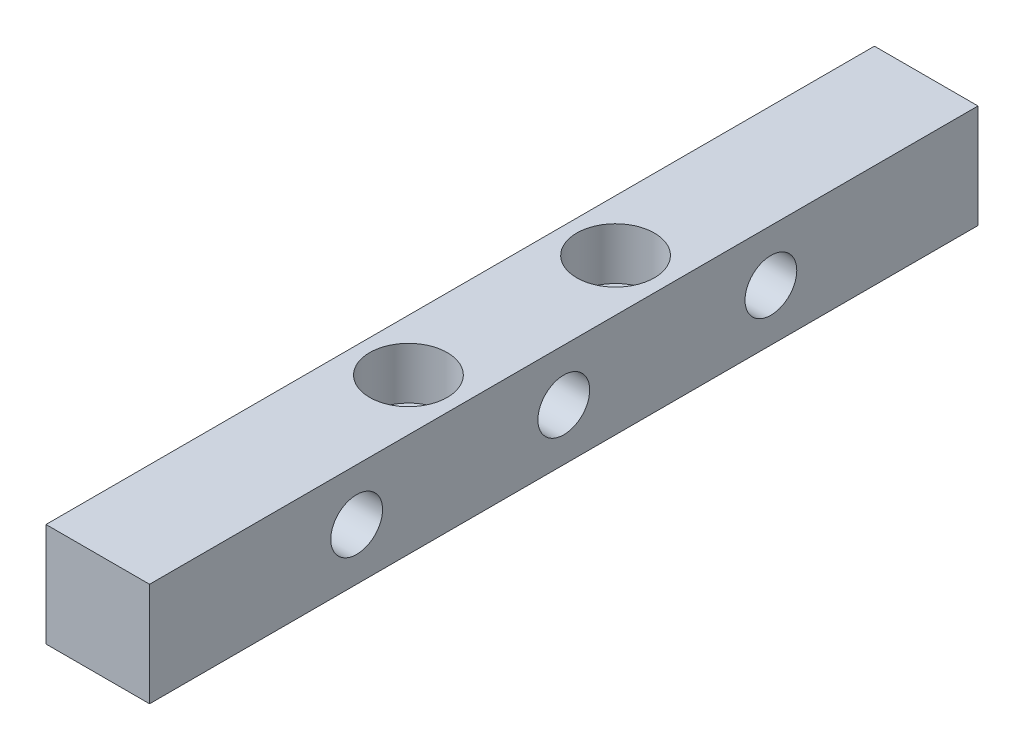
ISO-10303-21;
HEADER;
FILE_DESCRIPTION(('STEP AP214'),'2;1');
FILE_NAME('part.step','',(''),(''),'','','');
FILE_SCHEMA(('AUTOMOTIVE_DESIGN { 1 0 10303 214 1 1 1 1 }'));
ENDSEC;
DATA;
#1=APPLICATION_CONTEXT('core data for automotive mechanical design processes');
#2=APPLICATION_PROTOCOL_DEFINITION('international standard','automotive_design',2000,#1);
#3=PRODUCT_CONTEXT('',#1,'mechanical');
#4=PRODUCT('Part','Part','',(#3));
#5=PRODUCT_RELATED_PRODUCT_CATEGORY('part','',(#4));
#6=PRODUCT_DEFINITION_FORMATION('','',#4);
#7=PRODUCT_DEFINITION_CONTEXT('part definition',#1,'design');
#8=PRODUCT_DEFINITION('design','',#6,#7);
#9=PRODUCT_DEFINITION_SHAPE('','',#8);
#10=(LENGTH_UNIT() NAMED_UNIT(*) SI_UNIT(.MILLI.,.METRE.));
#11=(NAMED_UNIT(*) PLANE_ANGLE_UNIT() SI_UNIT($,.RADIAN.));
#12=(NAMED_UNIT(*) SI_UNIT($,.STERADIAN.) SOLID_ANGLE_UNIT());
#13=UNCERTAINTY_MEASURE_WITH_UNIT(LENGTH_MEASURE(1.E-05),#10,'distance_accuracy_value','');
#14=(GEOMETRIC_REPRESENTATION_CONTEXT(3) GLOBAL_UNCERTAINTY_ASSIGNED_CONTEXT((#13)) GLOBAL_UNIT_ASSIGNED_CONTEXT((#10,
#11,#12)) REPRESENTATION_CONTEXT('',''));
#15=CARTESIAN_POINT('',(0.,0.,0.));
#16=DIRECTION('',(0.,0.,1.));
#17=DIRECTION('',(1.,0.,0.));
#18=AXIS2_PLACEMENT_3D('',#15,#16,#17);
#19=CARTESIAN_POINT('',(-6.35000000000002,-6.35000000000006,50.8));
#20=DIRECTION('',(1.,0.,0.));
#21=DIRECTION('',(0.,0.,-1.));
#22=AXIS2_PLACEMENT_3D('',#19,#20,#21);
#23=PLANE('',#22);
#24=CARTESIAN_POINT('',(-6.35000000000005,0.,25.4));
#25=DIRECTION('',(1.,0.,0.));
#26=DIRECTION('',(0.,0.,-1.));
#27=AXIS2_PLACEMENT_3D('',#24,#25,#26);
#28=CIRCLE('',#27,3.17499999999999);
#29=CARTESIAN_POINT('',(-6.35000000000005,0.,22.225));
#30=VERTEX_POINT('',#29);
#31=EDGE_CURVE('E145',#30,#30,#28,.T.);
#32=ORIENTED_EDGE('',*,*,#31,.T.);
#33=EDGE_LOOP('',(#32));
#34=FACE_BOUND('',#33,.T.);
#35=CARTESIAN_POINT('',(-6.35000000000005,0.,0.));
#36=DIRECTION('',(1.,0.,0.));
#37=DIRECTION('',(0.,0.,-1.));
#38=AXIS2_PLACEMENT_3D('',#35,#36,#37);
#39=CIRCLE('',#38,3.17499999999999);
#40=CARTESIAN_POINT('',(-6.35000000000005,0.,-3.17499999999999));
#41=VERTEX_POINT('',#40);
#42=EDGE_CURVE('E139',#41,#41,#39,.T.);
#43=ORIENTED_EDGE('',*,*,#42,.T.);
#44=EDGE_LOOP('',(#43));
#45=FACE_BOUND('',#44,.T.);
#46=CARTESIAN_POINT('',(-6.35000000000005,0.,-25.4));
#47=DIRECTION('',(1.,0.,0.));
#48=DIRECTION('',(0.,0.,-1.));
#49=AXIS2_PLACEMENT_3D('',#46,#47,#48);
#50=CIRCLE('',#49,3.17499999999999);
#51=CARTESIAN_POINT('',(-6.35000000000005,0.,-28.575));
#52=VERTEX_POINT('',#51);
#53=EDGE_CURVE('E133',#52,#52,#50,.T.);
#54=ORIENTED_EDGE('',*,*,#53,.T.);
#55=EDGE_LOOP('',(#54));
#56=FACE_BOUND('',#55,.T.);
#57=DIRECTION('',(0.,-1.,0.));
#58=VECTOR('',#57,1.);
#59=CARTESIAN_POINT('',(-6.35000000000002,-6.35000000000006,-50.8));
#60=LINE('',#59,#58);
#61=CARTESIAN_POINT('',(-6.35000000000002,6.34999999999997,-50.8));
#62=VERTEX_POINT('',#61);
#63=CARTESIAN_POINT('',(-6.35000000000002,-6.35000000000006,-50.8));
#64=VERTEX_POINT('',#63);
#65=EDGE_CURVE('E96',#62,#64,#60,.T.);
#66=ORIENTED_EDGE('',*,*,#65,.T.);
#67=DIRECTION('',(0.,0.,-1.));
#68=VECTOR('',#67,1.);
#69=CARTESIAN_POINT('',(-6.35000000000002,-6.35000000000006,50.8));
#70=LINE('',#69,#68);
#71=CARTESIAN_POINT('',(-6.35000000000002,-6.35000000000006,50.8));
#72=VERTEX_POINT('',#71);
#73=EDGE_CURVE('E11',#72,#64,#70,.T.);
#74=ORIENTED_EDGE('',*,*,#73,.F.);
#75=DIRECTION('',(0.,-1.,0.));
#76=VECTOR('',#75,1.);
#77=CARTESIAN_POINT('',(-6.35000000000002,-6.35000000000006,50.8));
#78=LINE('',#77,#76);
#79=CARTESIAN_POINT('',(-6.35000000000002,6.34999999999997,50.8));
#80=VERTEX_POINT('',#79);
#81=EDGE_CURVE('E84',#80,#72,#78,.T.);
#82=ORIENTED_EDGE('',*,*,#81,.F.);
#83=DIRECTION('',(0.,0.,-1.));
#84=VECTOR('',#83,1.);
#85=CARTESIAN_POINT('',(-6.35000000000002,6.34999999999997,50.8));
#86=LINE('',#85,#84);
#87=EDGE_CURVE('E92',#80,#62,#86,.T.);
#88=ORIENTED_EDGE('',*,*,#87,.T.);
#89=EDGE_LOOP('',(#66,#74,#82,#88));
#90=FACE_BOUND('',#89,.T.);
#91=ADVANCED_FACE('F33',(#34,#45,#56,#90),#23,.F.);
#92=CARTESIAN_POINT('',(-6.35000000000002,-6.35000000000006,50.8));
#93=DIRECTION('',(0.,1.,0.));
#94=DIRECTION('',(0.,0.,1.));
#95=AXIS2_PLACEMENT_3D('',#92,#93,#94);
#96=PLANE('',#95);
#97=CARTESIAN_POINT('',(0.,-6.35000000000006,-12.7));
#98=DIRECTION('',(0.,1.,0.));
#99=DIRECTION('',(0.,0.,1.));
#100=AXIS2_PLACEMENT_3D('',#97,#98,#99);
#101=CIRCLE('',#100,3.175);
#102=CARTESIAN_POINT('',(0.,-6.35000000000006,-9.525));
#103=VERTEX_POINT('',#102);
#104=EDGE_CURVE('E121',#103,#103,#101,.T.);
#105=ORIENTED_EDGE('',*,*,#104,.T.);
#106=EDGE_LOOP('',(#105));
#107=FACE_BOUND('',#106,.T.);
#108=CARTESIAN_POINT('',(0.,-6.35000000000006,12.7));
#109=DIRECTION('',(0.,1.,0.));
#110=DIRECTION('',(0.,0.,1.));
#111=AXIS2_PLACEMENT_3D('',#108,#109,#110);
#112=CIRCLE('',#111,3.175);
#113=CARTESIAN_POINT('',(0.,-6.35000000000006,15.875));
#114=VERTEX_POINT('',#113);
#115=EDGE_CURVE('E99',#114,#114,#112,.T.);
#116=ORIENTED_EDGE('',*,*,#115,.T.);
#117=EDGE_LOOP('',(#116));
#118=FACE_BOUND('',#117,.T.);
#119=DIRECTION('',(1.,0.,0.));
#120=VECTOR('',#119,1.);
#121=CARTESIAN_POINT('',(-6.35000000000002,-6.35000000000006,-50.8));
#122=LINE('',#121,#120);
#123=CARTESIAN_POINT('',(6.34999999999997,-6.35000000000006,-50.8));
#124=VERTEX_POINT('',#123);
#125=EDGE_CURVE('E88',#64,#124,#122,.T.);
#126=ORIENTED_EDGE('',*,*,#125,.T.);
#127=DIRECTION('',(0.,0.,-1.));
#128=VECTOR('',#127,1.);
#129=CARTESIAN_POINT('',(6.34999999999997,-6.35000000000006,50.8));
#130=LINE('',#129,#128);
#131=CARTESIAN_POINT('',(6.34999999999997,-6.35000000000006,50.8));
#132=VERTEX_POINT('',#131);
#133=EDGE_CURVE('E41',#132,#124,#130,.T.);
#134=ORIENTED_EDGE('',*,*,#133,.F.);
#135=DIRECTION('',(1.,0.,0.));
#136=VECTOR('',#135,1.);
#137=CARTESIAN_POINT('',(-6.35000000000002,-6.35000000000006,50.8));
#138=LINE('',#137,#136);
#139=EDGE_CURVE('E79',#72,#132,#138,.T.);
#140=ORIENTED_EDGE('',*,*,#139,.F.);
#141=ORIENTED_EDGE('',*,*,#73,.T.);
#142=EDGE_LOOP('',(#126,#134,#140,#141));
#143=FACE_BOUND('',#142,.T.);
#144=ADVANCED_FACE('F87',(#107,#118,#143),#96,.F.);
#145=CARTESIAN_POINT('',(6.34999999999997,-6.35000000000006,50.8));
#146=DIRECTION('',(-1.,0.,0.));
#147=DIRECTION('',(0.,-1.,0.));
#148=AXIS2_PLACEMENT_3D('',#145,#146,#147);
#149=PLANE('',#148);
#150=CARTESIAN_POINT('',(6.35,0.,25.4));
#151=DIRECTION('',(1.,0.,0.));
#152=DIRECTION('',(0.,0.,-1.));
#153=AXIS2_PLACEMENT_3D('',#150,#151,#152);
#154=CIRCLE('',#153,3.17499999999999);
#155=CARTESIAN_POINT('',(6.35,0.,22.225));
#156=VERTEX_POINT('',#155);
#157=EDGE_CURVE('E148',#156,#156,#154,.T.);
#158=ORIENTED_EDGE('',*,*,#157,.F.);
#159=EDGE_LOOP('',(#158));
#160=FACE_BOUND('',#159,.T.);
#161=CARTESIAN_POINT('',(6.35,0.,0.));
#162=DIRECTION('',(1.,0.,0.));
#163=DIRECTION('',(0.,0.,-1.));
#164=AXIS2_PLACEMENT_3D('',#161,#162,#163);
#165=CIRCLE('',#164,3.17499999999999);
#166=CARTESIAN_POINT('',(6.35,0.,-3.17499999999999));
#167=VERTEX_POINT('',#166);
#168=EDGE_CURVE('E142',#167,#167,#165,.T.);
#169=ORIENTED_EDGE('',*,*,#168,.F.);
#170=EDGE_LOOP('',(#169));
#171=FACE_BOUND('',#170,.T.);
#172=CARTESIAN_POINT('',(6.35,0.,-25.4));
#173=DIRECTION('',(1.,0.,0.));
#174=DIRECTION('',(0.,0.,-1.));
#175=AXIS2_PLACEMENT_3D('',#172,#173,#174);
#176=CIRCLE('',#175,3.17499999999999);
#177=CARTESIAN_POINT('',(6.35,0.,-28.575));
#178=VERTEX_POINT('',#177);
#179=EDGE_CURVE('E136',#178,#178,#176,.T.);
#180=ORIENTED_EDGE('',*,*,#179,.F.);
#181=EDGE_LOOP('',(#180));
#182=FACE_BOUND('',#181,.T.);
#183=DIRECTION('',(0.,1.,0.));
#184=VECTOR('',#183,1.);
#185=CARTESIAN_POINT('',(6.34999999999997,-6.35000000000006,-50.8));
#186=LINE('',#185,#184);
#187=CARTESIAN_POINT('',(6.35000000000002,6.34999999999997,-50.8));
#188=VERTEX_POINT('',#187);
#189=EDGE_CURVE('E66',#124,#188,#186,.T.);
#190=ORIENTED_EDGE('',*,*,#189,.T.);
#191=DIRECTION('',(0.,0.,-1.));
#192=VECTOR('',#191,1.);
#193=CARTESIAN_POINT('',(6.35000000000002,6.34999999999997,50.8));
#194=LINE('',#193,#192);
#195=CARTESIAN_POINT('',(6.35000000000002,6.34999999999997,50.8));
#196=VERTEX_POINT('',#195);
#197=EDGE_CURVE('E89',#196,#188,#194,.T.);
#198=ORIENTED_EDGE('',*,*,#197,.F.);
#199=DIRECTION('',(0.,1.,0.));
#200=VECTOR('',#199,1.);
#201=CARTESIAN_POINT('',(6.34999999999997,-6.35000000000006,50.8));
#202=LINE('',#201,#200);
#203=EDGE_CURVE('E82',#132,#196,#202,.T.);
#204=ORIENTED_EDGE('',*,*,#203,.F.);
#205=ORIENTED_EDGE('',*,*,#133,.T.);
#206=EDGE_LOOP('',(#190,#198,#204,#205));
#207=FACE_BOUND('',#206,.T.);
#208=ADVANCED_FACE('F90',(#160,#171,#182,#207),#149,.F.);
#209=CARTESIAN_POINT('',(-6.35000000000002,6.34999999999997,50.8));
#210=DIRECTION('',(0.,-1.,0.));
#211=DIRECTION('',(0.,0.,-1.));
#212=AXIS2_PLACEMENT_3D('',#209,#210,#211);
#213=PLANE('',#212);
#214=CARTESIAN_POINT('',(0.,6.34999999999997,-12.7));
#215=DIRECTION('',(0.,1.,0.));
#216=DIRECTION('',(0.,0.,1.));
#217=AXIS2_PLACEMENT_3D('',#214,#215,#216);
#218=CIRCLE('',#217,4.7625);
#219=CARTESIAN_POINT('',(0.,6.34999999999997,-7.9375));
#220=VERTEX_POINT('',#219);
#221=EDGE_CURVE('E130',#220,#220,#218,.T.);
#222=ORIENTED_EDGE('',*,*,#221,.F.);
#223=EDGE_LOOP('',(#222));
#224=FACE_BOUND('',#223,.T.);
#225=CARTESIAN_POINT('',(0.,6.34999999999997,12.7));
#226=DIRECTION('',(0.,1.,0.));
#227=DIRECTION('',(0.,0.,1.));
#228=AXIS2_PLACEMENT_3D('',#225,#226,#227);
#229=CIRCLE('',#228,4.7625);
#230=CARTESIAN_POINT('',(0.,6.34999999999997,17.4625));
#231=VERTEX_POINT('',#230);
#232=EDGE_CURVE('E118',#231,#231,#229,.T.);
#233=ORIENTED_EDGE('',*,*,#232,.F.);
#234=EDGE_LOOP('',(#233));
#235=FACE_BOUND('',#234,.T.);
#236=DIRECTION('',(-1.,0.,0.));
#237=VECTOR('',#236,1.);
#238=CARTESIAN_POINT('',(-6.35000000000002,6.34999999999997,-50.8));
#239=LINE('',#238,#237);
#240=EDGE_CURVE('E72',#188,#62,#239,.T.);
#241=ORIENTED_EDGE('',*,*,#240,.T.);
#242=ORIENTED_EDGE('',*,*,#87,.F.);
#243=DIRECTION('',(-1.,0.,0.));
#244=VECTOR('',#243,1.);
#245=CARTESIAN_POINT('',(-6.35000000000002,6.34999999999997,50.8));
#246=LINE('',#245,#244);
#247=EDGE_CURVE('E49',#196,#80,#246,.T.);
#248=ORIENTED_EDGE('',*,*,#247,.F.);
#249=ORIENTED_EDGE('',*,*,#197,.T.);
#250=EDGE_LOOP('',(#241,#242,#248,#249));
#251=FACE_BOUND('',#250,.T.);
#252=ADVANCED_FACE('F104',(#224,#235,#251),#213,.F.);
#253=CARTESIAN_POINT('',(0.,0.,50.8));
#254=DIRECTION('',(0.,0.,-1.));
#255=DIRECTION('',(-1.,0.,0.));
#256=AXIS2_PLACEMENT_3D('',#253,#254,#255);
#257=PLANE('',#256);
#258=ORIENTED_EDGE('',*,*,#81,.T.);
#259=ORIENTED_EDGE('',*,*,#139,.T.);
#260=ORIENTED_EDGE('',*,*,#203,.T.);
#261=ORIENTED_EDGE('',*,*,#247,.T.);
#262=EDGE_LOOP('',(#258,#259,#260,#261));
#263=FACE_BOUND('',#262,.T.);
#264=ADVANCED_FACE('F80',(#263),#257,.F.);
#265=CARTESIAN_POINT('',(0.,0.,-50.8));
#266=DIRECTION('',(0.,0.,-1.));
#267=DIRECTION('',(-1.,0.,0.));
#268=AXIS2_PLACEMENT_3D('',#265,#266,#267);
#269=PLANE('',#268);
#270=ORIENTED_EDGE('',*,*,#65,.F.);
#271=ORIENTED_EDGE('',*,*,#240,.F.);
#272=ORIENTED_EDGE('',*,*,#189,.F.);
#273=ORIENTED_EDGE('',*,*,#125,.F.);
#274=EDGE_LOOP('',(#270,#271,#272,#273));
#275=FACE_BOUND('',#274,.T.);
#276=ADVANCED_FACE('F107',(#275),#269,.T.);
#277=CARTESIAN_POINT('',(0.,6.34999999999997,12.7));
#278=DIRECTION('',(0.,1.,0.));
#279=DIRECTION('',(0.,0.,1.));
#280=AXIS2_PLACEMENT_3D('',#277,#278,#279);
#281=CYLINDRICAL_SURFACE('',#280,3.175);
#282=ORIENTED_EDGE('',*,*,#115,.F.);
#283=EDGE_LOOP('',(#282));
#284=FACE_BOUND('',#283,.T.);
#285=CARTESIAN_POINT('',(0.,0.,12.7));
#286=DIRECTION('',(0.,1.,0.));
#287=DIRECTION('',(0.,0.,1.));
#288=AXIS2_PLACEMENT_3D('',#285,#286,#287);
#289=CIRCLE('',#288,3.175);
#290=CARTESIAN_POINT('',(0.,0.,15.875));
#291=VERTEX_POINT('',#290);
#292=EDGE_CURVE('E112',#291,#291,#289,.T.);
#293=ORIENTED_EDGE('',*,*,#292,.T.);
#294=EDGE_LOOP('',(#293));
#295=FACE_BOUND('',#294,.T.);
#296=ADVANCED_FACE('F259',(#284,#295),#281,.F.);
#297=CARTESIAN_POINT('',(3.175,0.,12.7));
#298=DIRECTION('',(0.,-1.,0.));
#299=DIRECTION('',(0.,0.,-1.));
#300=AXIS2_PLACEMENT_3D('',#297,#298,#299);
#301=PLANE('',#300);
#302=ORIENTED_EDGE('',*,*,#292,.F.);
#303=EDGE_LOOP('',(#302));
#304=FACE_BOUND('',#303,.T.);
#305=CARTESIAN_POINT('',(0.,0.,12.7));
#306=DIRECTION('',(0.,1.,0.));
#307=DIRECTION('',(0.,0.,1.));
#308=AXIS2_PLACEMENT_3D('',#305,#306,#307);
#309=CIRCLE('',#308,4.7625);
#310=CARTESIAN_POINT('',(0.,0.,17.4625));
#311=VERTEX_POINT('',#310);
#312=EDGE_CURVE('E115',#311,#311,#309,.T.);
#313=ORIENTED_EDGE('',*,*,#312,.T.);
#314=EDGE_LOOP('',(#313));
#315=FACE_BOUND('',#314,.T.);
#316=ADVANCED_FACE('F249',(#304,#315),#301,.F.);
#317=CARTESIAN_POINT('',(0.,6.34999999999997,12.7));
#318=DIRECTION('',(0.,1.,0.));
#319=DIRECTION('',(0.,0.,1.));
#320=AXIS2_PLACEMENT_3D('',#317,#318,#319);
#321=CYLINDRICAL_SURFACE('',#320,4.7625);
#322=ORIENTED_EDGE('',*,*,#312,.F.);
#323=EDGE_LOOP('',(#322));
#324=FACE_BOUND('',#323,.T.);
#325=ORIENTED_EDGE('',*,*,#232,.T.);
#326=EDGE_LOOP('',(#325));
#327=FACE_BOUND('',#326,.T.);
#328=ADVANCED_FACE('F239',(#324,#327),#321,.F.);
#329=CARTESIAN_POINT('',(0.,6.34999999999997,-12.7));
#330=DIRECTION('',(0.,1.,0.));
#331=DIRECTION('',(0.,0.,1.));
#332=AXIS2_PLACEMENT_3D('',#329,#330,#331);
#333=CYLINDRICAL_SURFACE('',#332,3.175);
#334=ORIENTED_EDGE('',*,*,#104,.F.);
#335=EDGE_LOOP('',(#334));
#336=FACE_BOUND('',#335,.T.);
#337=CARTESIAN_POINT('',(0.,0.,-12.7));
#338=DIRECTION('',(0.,1.,0.));
#339=DIRECTION('',(0.,0.,1.));
#340=AXIS2_PLACEMENT_3D('',#337,#338,#339);
#341=CIRCLE('',#340,3.175);
#342=CARTESIAN_POINT('',(0.,0.,-9.525));
#343=VERTEX_POINT('',#342);
#344=EDGE_CURVE('E124',#343,#343,#341,.T.);
#345=ORIENTED_EDGE('',*,*,#344,.T.);
#346=EDGE_LOOP('',(#345));
#347=FACE_BOUND('',#346,.T.);
#348=ADVANCED_FACE('F229',(#336,#347),#333,.F.);
#349=CARTESIAN_POINT('',(3.175,0.,-12.7));
#350=DIRECTION('',(0.,-1.,0.));
#351=DIRECTION('',(0.,0.,-1.));
#352=AXIS2_PLACEMENT_3D('',#349,#350,#351);
#353=PLANE('',#352);
#354=ORIENTED_EDGE('',*,*,#344,.F.);
#355=EDGE_LOOP('',(#354));
#356=FACE_BOUND('',#355,.T.);
#357=CARTESIAN_POINT('',(0.,0.,-12.7));
#358=DIRECTION('',(0.,1.,0.));
#359=DIRECTION('',(0.,0.,1.));
#360=AXIS2_PLACEMENT_3D('',#357,#358,#359);
#361=CIRCLE('',#360,4.7625);
#362=CARTESIAN_POINT('',(0.,0.,-7.9375));
#363=VERTEX_POINT('',#362);
#364=EDGE_CURVE('E127',#363,#363,#361,.T.);
#365=ORIENTED_EDGE('',*,*,#364,.T.);
#366=EDGE_LOOP('',(#365));
#367=FACE_BOUND('',#366,.T.);
#368=ADVANCED_FACE('F173',(#356,#367),#353,.F.);
#369=CARTESIAN_POINT('',(0.,6.34999999999997,-12.7));
#370=DIRECTION('',(0.,1.,0.));
#371=DIRECTION('',(0.,0.,1.));
#372=AXIS2_PLACEMENT_3D('',#369,#370,#371);
#373=CYLINDRICAL_SURFACE('',#372,4.7625);
#374=ORIENTED_EDGE('',*,*,#364,.F.);
#375=EDGE_LOOP('',(#374));
#376=FACE_BOUND('',#375,.T.);
#377=ORIENTED_EDGE('',*,*,#221,.T.);
#378=EDGE_LOOP('',(#377));
#379=FACE_BOUND('',#378,.T.);
#380=ADVANCED_FACE('F164',(#376,#379),#373,.F.);
#381=CARTESIAN_POINT('',(6.34999999999999,0.,-25.4));
#382=DIRECTION('',(1.,0.,0.));
#383=DIRECTION('',(0.,0.,-1.));
#384=AXIS2_PLACEMENT_3D('',#381,#382,#383);
#385=CYLINDRICAL_SURFACE('',#384,3.17499999999999);
#386=ORIENTED_EDGE('',*,*,#53,.F.);
#387=EDGE_LOOP('',(#386));
#388=FACE_BOUND('',#387,.T.);
#389=ORIENTED_EDGE('',*,*,#179,.T.);
#390=EDGE_LOOP('',(#389));
#391=FACE_BOUND('',#390,.T.);
#392=ADVANCED_FACE('F161',(#388,#391),#385,.F.);
#393=CARTESIAN_POINT('',(6.34999999999999,0.,0.));
#394=DIRECTION('',(1.,0.,0.));
#395=DIRECTION('',(0.,0.,-1.));
#396=AXIS2_PLACEMENT_3D('',#393,#394,#395);
#397=CYLINDRICAL_SURFACE('',#396,3.17499999999999);
#398=ORIENTED_EDGE('',*,*,#42,.F.);
#399=EDGE_LOOP('',(#398));
#400=FACE_BOUND('',#399,.T.);
#401=ORIENTED_EDGE('',*,*,#168,.T.);
#402=EDGE_LOOP('',(#401));
#403=FACE_BOUND('',#402,.T.);
#404=ADVANCED_FACE('F163',(#400,#403),#397,.F.);
#405=CARTESIAN_POINT('',(6.34999999999999,0.,25.4));
#406=DIRECTION('',(1.,0.,0.));
#407=DIRECTION('',(0.,0.,-1.));
#408=AXIS2_PLACEMENT_3D('',#405,#406,#407);
#409=CYLINDRICAL_SURFACE('',#408,3.17499999999999);
#410=ORIENTED_EDGE('',*,*,#31,.F.);
#411=EDGE_LOOP('',(#410));
#412=FACE_BOUND('',#411,.T.);
#413=ORIENTED_EDGE('',*,*,#157,.T.);
#414=EDGE_LOOP('',(#413));
#415=FACE_BOUND('',#414,.T.);
#416=ADVANCED_FACE('F152',(#412,#415),#409,.F.);
#417=CLOSED_SHELL('',(#91,#144,#208,#252,#264,#276,#296,#316,#328,#348,#368,#380,#392,#404,#416));
#418=MANIFOLD_SOLID_BREP('B2',#417);
#419=ADVANCED_BREP_SHAPE_REPRESENTATION('',(#18,#418),#14);
#420=SHAPE_DEFINITION_REPRESENTATION(#9,#419);
ENDSEC;
END-ISO-10303-21;
